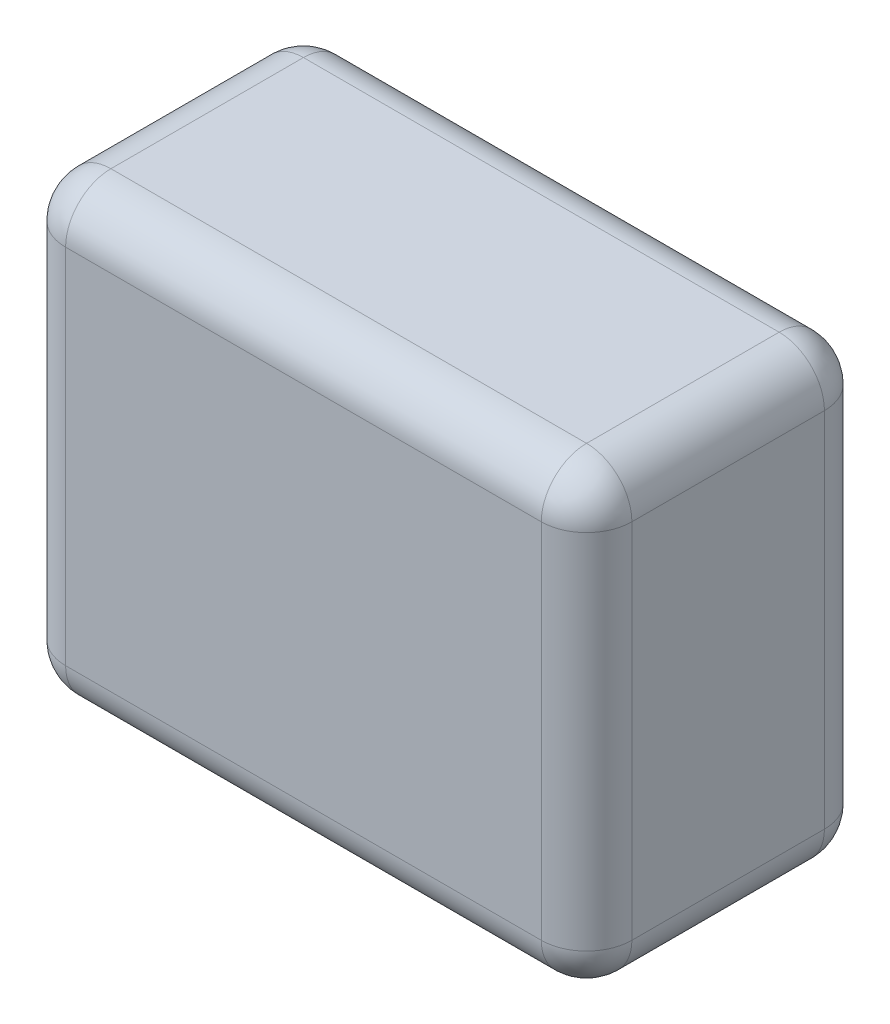
ISO-10303-21;
HEADER;
FILE_DESCRIPTION(('STEP AP214'),'2;1');
FILE_NAME('part.step','',(''),(''),'','','');
FILE_SCHEMA(('AUTOMOTIVE_DESIGN { 1 0 10303 214 1 1 1 1 }'));
ENDSEC;
DATA;
#1=APPLICATION_CONTEXT('core data for automotive mechanical design processes');
#2=APPLICATION_PROTOCOL_DEFINITION('international standard','automotive_design',2000,#1);
#3=PRODUCT_CONTEXT('',#1,'mechanical');
#4=PRODUCT('Part','Part','',(#3));
#5=PRODUCT_RELATED_PRODUCT_CATEGORY('part','',(#4));
#6=PRODUCT_DEFINITION_FORMATION('','',#4);
#7=PRODUCT_DEFINITION_CONTEXT('part definition',#1,'design');
#8=PRODUCT_DEFINITION('design','',#6,#7);
#9=PRODUCT_DEFINITION_SHAPE('','',#8);
#10=(LENGTH_UNIT() NAMED_UNIT(*) SI_UNIT(.MILLI.,.METRE.));
#11=(NAMED_UNIT(*) PLANE_ANGLE_UNIT() SI_UNIT($,.RADIAN.));
#12=(NAMED_UNIT(*) SI_UNIT($,.STERADIAN.) SOLID_ANGLE_UNIT());
#13=UNCERTAINTY_MEASURE_WITH_UNIT(LENGTH_MEASURE(1.E-05),#10,'distance_accuracy_value','');
#14=(GEOMETRIC_REPRESENTATION_CONTEXT(3) GLOBAL_UNCERTAINTY_ASSIGNED_CONTEXT((#13)) GLOBAL_UNIT_ASSIGNED_CONTEXT((#10,
#11,#12)) REPRESENTATION_CONTEXT('',''));
#15=CARTESIAN_POINT('',(0.,0.,0.));
#16=DIRECTION('',(0.,0.,1.));
#17=DIRECTION('',(1.,0.,0.));
#18=AXIS2_PLACEMENT_3D('',#15,#16,#17);
#19=CARTESIAN_POINT('',(25.,20.,25.));
#20=DIRECTION('',(-1.,0.,0.));
#21=DIRECTION('',(0.,-1.,0.));
#22=AXIS2_PLACEMENT_3D('',#19,#20,#21);
#23=PLANE('',#22);
#24=DIRECTION('',(0.,1.,0.));
#25=VECTOR('',#24,1.);
#26=CARTESIAN_POINT('',(25.,-20.,21.));
#27=LINE('',#26,#25);
#28=CARTESIAN_POINT('',(25.,16.,21.));
#29=VERTEX_POINT('',#28);
#30=CARTESIAN_POINT('',(25.,-16.,21.));
#31=VERTEX_POINT('',#30);
#32=EDGE_CURVE('E155',#29,#31,#27,.F.);
#33=ORIENTED_EDGE('',*,*,#32,.T.);
#34=DIRECTION('',(0.,0.,-1.));
#35=VECTOR('',#34,1.);
#36=CARTESIAN_POINT('',(25.,-16.,25.));
#37=LINE('',#36,#35);
#38=CARTESIAN_POINT('',(25.,-16.,4.));
#39=VERTEX_POINT('',#38);
#40=EDGE_CURVE('E158',#31,#39,#37,.T.);
#41=ORIENTED_EDGE('',*,*,#40,.T.);
#42=DIRECTION('',(0.,1.,0.));
#43=VECTOR('',#42,1.);
#44=CARTESIAN_POINT('',(25.,20.,4.));
#45=LINE('',#44,#43);
#46=CARTESIAN_POINT('',(25.,16.,4.));
#47=VERTEX_POINT('',#46);
#48=EDGE_CURVE('E131',#39,#47,#45,.T.);
#49=ORIENTED_EDGE('',*,*,#48,.T.);
#50=DIRECTION('',(0.,0.,-1.));
#51=VECTOR('',#50,1.);
#52=CARTESIAN_POINT('',(25.,16.,25.));
#53=LINE('',#52,#51);
#54=EDGE_CURVE('E149',#47,#29,#53,.F.);
#55=ORIENTED_EDGE('',*,*,#54,.T.);
#56=EDGE_LOOP('',(#33,#41,#49,#55));
#57=FACE_BOUND('',#56,.T.);
#58=ADVANCED_FACE('F37',(#57),#23,.F.);
#59=CARTESIAN_POINT('',(-25.,20.,25.));
#60=DIRECTION('',(0.,-1.,0.));
#61=DIRECTION('',(0.,0.,-1.));
#62=AXIS2_PLACEMENT_3D('',#59,#60,#61);
#63=PLANE('',#62);
#64=DIRECTION('',(0.,0.,-1.));
#65=VECTOR('',#64,1.);
#66=CARTESIAN_POINT('',(21.,20.,25.));
#67=LINE('',#66,#65);
#68=CARTESIAN_POINT('',(21.,20.,21.));
#69=VERTEX_POINT('',#68);
#70=CARTESIAN_POINT('',(21.,20.,4.));
#71=VERTEX_POINT('',#70);
#72=EDGE_CURVE('E173',#69,#71,#67,.T.);
#73=ORIENTED_EDGE('',*,*,#72,.T.);
#74=DIRECTION('',(-1.,0.,0.));
#75=VECTOR('',#74,1.);
#76=CARTESIAN_POINT('',(-25.,20.,4.));
#77=LINE('',#76,#75);
#78=CARTESIAN_POINT('',(-21.,20.,4.));
#79=VERTEX_POINT('',#78);
#80=EDGE_CURVE('E177',#71,#79,#77,.T.);
#81=ORIENTED_EDGE('',*,*,#80,.T.);
#82=DIRECTION('',(0.,0.,-1.));
#83=VECTOR('',#82,1.);
#84=CARTESIAN_POINT('',(-21.,20.,25.));
#85=LINE('',#84,#83);
#86=CARTESIAN_POINT('',(-21.,20.,21.));
#87=VERTEX_POINT('',#86);
#88=EDGE_CURVE('E175',#79,#87,#85,.F.);
#89=ORIENTED_EDGE('',*,*,#88,.T.);
#90=DIRECTION('',(-1.,0.,0.));
#91=VECTOR('',#90,1.);
#92=CARTESIAN_POINT('',(25.,20.,21.));
#93=LINE('',#92,#91);
#94=EDGE_CURVE('E171',#87,#69,#93,.F.);
#95=ORIENTED_EDGE('',*,*,#94,.T.);
#96=EDGE_LOOP('',(#73,#81,#89,#95));
#97=FACE_BOUND('',#96,.T.);
#98=ADVANCED_FACE('F326',(#97),#63,.F.);
#99=CARTESIAN_POINT('',(-25.,20.,25.));
#100=DIRECTION('',(1.,0.,0.));
#101=DIRECTION('',(0.,1.,0.));
#102=AXIS2_PLACEMENT_3D('',#99,#100,#101);
#103=PLANE('',#102);
#104=DIRECTION('',(0.,-1.,0.));
#105=VECTOR('',#104,1.);
#106=CARTESIAN_POINT('',(-25.,20.,4.));
#107=LINE('',#106,#105);
#108=CARTESIAN_POINT('',(-25.,16.,4.));
#109=VERTEX_POINT('',#108);
#110=CARTESIAN_POINT('',(-25.,-16.,4.));
#111=VERTEX_POINT('',#110);
#112=EDGE_CURVE('E184',#109,#111,#107,.T.);
#113=ORIENTED_EDGE('',*,*,#112,.T.);
#114=DIRECTION('',(0.,0.,-1.));
#115=VECTOR('',#114,1.);
#116=CARTESIAN_POINT('',(-25.,-16.,25.));
#117=LINE('',#116,#115);
#118=CARTESIAN_POINT('',(-25.,-16.,21.));
#119=VERTEX_POINT('',#118);
#120=EDGE_CURVE('E187',#111,#119,#117,.F.);
#121=ORIENTED_EDGE('',*,*,#120,.T.);
#122=DIRECTION('',(0.,-1.,0.));
#123=VECTOR('',#122,1.);
#124=CARTESIAN_POINT('',(-25.,20.,21.));
#125=LINE('',#124,#123);
#126=CARTESIAN_POINT('',(-25.,16.,21.));
#127=VERTEX_POINT('',#126);
#128=EDGE_CURVE('E182',#119,#127,#125,.F.);
#129=ORIENTED_EDGE('',*,*,#128,.T.);
#130=DIRECTION('',(0.,0.,-1.));
#131=VECTOR('',#130,1.);
#132=CARTESIAN_POINT('',(-25.,16.,25.));
#133=LINE('',#132,#131);
#134=EDGE_CURVE('E180',#127,#109,#133,.T.);
#135=ORIENTED_EDGE('',*,*,#134,.T.);
#136=EDGE_LOOP('',(#113,#121,#129,#135));
#137=FACE_BOUND('',#136,.T.);
#138=ADVANCED_FACE('F297',(#137),#103,.F.);
#139=CARTESIAN_POINT('',(-25.,-20.,25.));
#140=DIRECTION('',(0.,1.,0.));
#141=DIRECTION('',(0.,0.,1.));
#142=AXIS2_PLACEMENT_3D('',#139,#140,#141);
#143=PLANE('',#142);
#144=DIRECTION('',(1.,0.,0.));
#145=VECTOR('',#144,1.);
#146=CARTESIAN_POINT('',(-25.,-20.,4.));
#147=LINE('',#146,#145);
#148=CARTESIAN_POINT('',(-21.,-20.,4.));
#149=VERTEX_POINT('',#148);
#150=CARTESIAN_POINT('',(21.,-20.,4.));
#151=VERTEX_POINT('',#150);
#152=EDGE_CURVE('E193',#149,#151,#147,.T.);
#153=ORIENTED_EDGE('',*,*,#152,.T.);
#154=DIRECTION('',(0.,0.,-1.));
#155=VECTOR('',#154,1.);
#156=CARTESIAN_POINT('',(21.,-20.,25.));
#157=LINE('',#156,#155);
#158=CARTESIAN_POINT('',(21.,-20.,21.));
#159=VERTEX_POINT('',#158);
#160=EDGE_CURVE('E196',#151,#159,#157,.F.);
#161=ORIENTED_EDGE('',*,*,#160,.T.);
#162=DIRECTION('',(1.,0.,0.));
#163=VECTOR('',#162,1.);
#164=CARTESIAN_POINT('',(-25.,-20.,21.));
#165=LINE('',#164,#163);
#166=CARTESIAN_POINT('',(-21.,-20.,21.));
#167=VERTEX_POINT('',#166);
#168=EDGE_CURVE('E191',#159,#167,#165,.F.);
#169=ORIENTED_EDGE('',*,*,#168,.T.);
#170=DIRECTION('',(0.,0.,-1.));
#171=VECTOR('',#170,1.);
#172=CARTESIAN_POINT('',(-21.,-20.,25.));
#173=LINE('',#172,#171);
#174=EDGE_CURVE('E189',#167,#149,#173,.T.);
#175=ORIENTED_EDGE('',*,*,#174,.T.);
#176=EDGE_LOOP('',(#153,#161,#169,#175));
#177=FACE_BOUND('',#176,.T.);
#178=ADVANCED_FACE('F270',(#177),#143,.F.);
#179=CARTESIAN_POINT('',(0.,0.,25.));
#180=DIRECTION('',(0.,0.,1.));
#181=DIRECTION('',(1.,0.,0.));
#182=AXIS2_PLACEMENT_3D('',#179,#180,#181);
#183=PLANE('',#182);
#184=DIRECTION('',(0.,-1.,0.));
#185=VECTOR('',#184,1.);
#186=CARTESIAN_POINT('',(-21.,-20.,25.));
#187=LINE('',#186,#185);
#188=CARTESIAN_POINT('',(-21.,16.,25.));
#189=VERTEX_POINT('',#188);
#190=CARTESIAN_POINT('',(-21.,-16.,25.));
#191=VERTEX_POINT('',#190);
#192=EDGE_CURVE('E57',#189,#191,#187,.T.);
#193=ORIENTED_EDGE('',*,*,#192,.T.);
#194=DIRECTION('',(1.,0.,0.));
#195=VECTOR('',#194,1.);
#196=CARTESIAN_POINT('',(25.,-16.,25.));
#197=LINE('',#196,#195);
#198=CARTESIAN_POINT('',(21.,-16.,25.));
#199=VERTEX_POINT('',#198);
#200=EDGE_CURVE('E11',#191,#199,#197,.T.);
#201=ORIENTED_EDGE('',*,*,#200,.T.);
#202=DIRECTION('',(0.,1.,0.));
#203=VECTOR('',#202,1.);
#204=CARTESIAN_POINT('',(21.,20.,25.));
#205=LINE('',#204,#203);
#206=CARTESIAN_POINT('',(21.,16.,25.));
#207=VERTEX_POINT('',#206);
#208=EDGE_CURVE('E46',#199,#207,#205,.T.);
#209=ORIENTED_EDGE('',*,*,#208,.T.);
#210=DIRECTION('',(-1.,0.,0.));
#211=VECTOR('',#210,1.);
#212=CARTESIAN_POINT('',(-25.,16.,25.));
#213=LINE('',#212,#211);
#214=EDGE_CURVE('E198',#207,#189,#213,.T.);
#215=ORIENTED_EDGE('',*,*,#214,.T.);
#216=EDGE_LOOP('',(#193,#201,#209,#215));
#217=FACE_BOUND('',#216,.T.);
#218=ADVANCED_FACE('F285',(#217),#183,.T.);
#219=CARTESIAN_POINT('',(0.,0.,0.));
#220=DIRECTION('',(0.,0.,1.));
#221=DIRECTION('',(1.,0.,0.));
#222=AXIS2_PLACEMENT_3D('',#219,#220,#221);
#223=PLANE('',#222);
#224=DIRECTION('',(-1.,0.,0.));
#225=VECTOR('',#224,1.);
#226=CARTESIAN_POINT('',(0.,16.,0.));
#227=LINE('',#226,#225);
#228=CARTESIAN_POINT('',(-21.,16.,0.));
#229=VERTEX_POINT('',#228);
#230=CARTESIAN_POINT('',(21.,16.,0.));
#231=VERTEX_POINT('',#230);
#232=EDGE_CURVE('E168',#229,#231,#227,.F.);
#233=ORIENTED_EDGE('',*,*,#232,.T.);
#234=DIRECTION('',(0.,1.,0.));
#235=VECTOR('',#234,1.);
#236=CARTESIAN_POINT('',(21.,0.,0.));
#237=LINE('',#236,#235);
#238=CARTESIAN_POINT('',(21.,-16.,0.));
#239=VERTEX_POINT('',#238);
#240=EDGE_CURVE('E133',#231,#239,#237,.F.);
#241=ORIENTED_EDGE('',*,*,#240,.T.);
#242=DIRECTION('',(1.,0.,0.));
#243=VECTOR('',#242,1.);
#244=CARTESIAN_POINT('',(0.,-16.,0.));
#245=LINE('',#244,#243);
#246=CARTESIAN_POINT('',(-21.,-16.,0.));
#247=VERTEX_POINT('',#246);
#248=EDGE_CURVE('E161',#239,#247,#245,.F.);
#249=ORIENTED_EDGE('',*,*,#248,.T.);
#250=DIRECTION('',(0.,-1.,0.));
#251=VECTOR('',#250,1.);
#252=CARTESIAN_POINT('',(-21.,0.,0.));
#253=LINE('',#252,#251);
#254=EDGE_CURVE('E166',#247,#229,#253,.F.);
#255=ORIENTED_EDGE('',*,*,#254,.T.);
#256=EDGE_LOOP('',(#233,#241,#249,#255));
#257=FACE_BOUND('',#256,.T.);
#258=ADVANCED_FACE('F503',(#257),#223,.F.);
#259=CARTESIAN_POINT('',(-21.,0.,21.));
#260=DIRECTION('',(0.,1.,0.));
#261=DIRECTION('',(-1.,0.,0.));
#262=AXIS2_PLACEMENT_3D('',#259,#260,#261);
#263=CYLINDRICAL_SURFACE('',#262,4.);
#264=CARTESIAN_POINT('',(-21.,-16.,21.));
#265=DIRECTION('',(0.,-1.,0.));
#266=DIRECTION('',(0.,0.,-1.));
#267=AXIS2_PLACEMENT_3D('',#264,#265,#266);
#268=CIRCLE('',#267,4.);
#269=EDGE_CURVE('E41',#191,#119,#268,.T.);
#270=ORIENTED_EDGE('',*,*,#269,.F.);
#271=ORIENTED_EDGE('',*,*,#192,.F.);
#272=CARTESIAN_POINT('',(-21.,16.,21.));
#273=DIRECTION('',(0.,1.,0.));
#274=DIRECTION('',(0.,0.,1.));
#275=AXIS2_PLACEMENT_3D('',#272,#273,#274);
#276=CIRCLE('',#275,4.);
#277=EDGE_CURVE('E250',#127,#189,#276,.T.);
#278=ORIENTED_EDGE('',*,*,#277,.F.);
#279=ORIENTED_EDGE('',*,*,#128,.F.);
#280=EDGE_LOOP('',(#270,#271,#278,#279));
#281=FACE_BOUND('',#280,.T.);
#282=ADVANCED_FACE('F39',(#281),#263,.T.);
#283=CARTESIAN_POINT('',(-21.,-16.,21.));
#284=DIRECTION('',(-1.,0.,0.));
#285=DIRECTION('',(0.,0.,1.));
#286=AXIS2_PLACEMENT_3D('',#283,#284,#285);
#287=SPHERICAL_SURFACE('',#286,4.);
#288=CARTESIAN_POINT('',(-21.,-16.,21.));
#289=DIRECTION('',(-1.,0.,0.));
#290=DIRECTION('',(0.,0.,1.));
#291=AXIS2_PLACEMENT_3D('',#288,#289,#290);
#292=CIRCLE('',#291,4.);
#293=EDGE_CURVE('E245',#191,#167,#292,.F.);
#294=ORIENTED_EDGE('',*,*,#293,.F.);
#295=ORIENTED_EDGE('',*,*,#269,.T.);
#296=CARTESIAN_POINT('',(-21.,-16.,21.));
#297=DIRECTION('',(0.,0.,1.));
#298=DIRECTION('',(1.,0.,0.));
#299=AXIS2_PLACEMENT_3D('',#296,#297,#298);
#300=CIRCLE('',#299,4.);
#301=EDGE_CURVE('E248',#167,#119,#300,.F.);
#302=ORIENTED_EDGE('',*,*,#301,.F.);
#303=EDGE_LOOP('',(#294,#295,#302));
#304=FACE_BOUND('',#303,.T.);
#305=ADVANCED_FACE('F260',(#304),#287,.T.);
#306=CARTESIAN_POINT('',(-21.,16.,21.));
#307=DIRECTION('',(0.,0.,1.));
#308=DIRECTION('',(1.,0.,0.));
#309=AXIS2_PLACEMENT_3D('',#306,#307,#308);
#310=SPHERICAL_SURFACE('',#309,4.);
#311=CARTESIAN_POINT('',(-21.,16.,21.));
#312=DIRECTION('',(0.,0.,1.));
#313=DIRECTION('',(1.,0.,0.));
#314=AXIS2_PLACEMENT_3D('',#311,#312,#313);
#315=CIRCLE('',#314,4.);
#316=EDGE_CURVE('E239',#127,#87,#315,.F.);
#317=ORIENTED_EDGE('',*,*,#316,.F.);
#318=ORIENTED_EDGE('',*,*,#277,.T.);
#319=CARTESIAN_POINT('',(-21.,16.,21.));
#320=DIRECTION('',(-1.,0.,0.));
#321=DIRECTION('',(0.,-1.,0.));
#322=AXIS2_PLACEMENT_3D('',#319,#320,#321);
#323=CIRCLE('',#322,4.);
#324=EDGE_CURVE('E242',#87,#189,#323,.F.);
#325=ORIENTED_EDGE('',*,*,#324,.F.);
#326=EDGE_LOOP('',(#317,#318,#325));
#327=FACE_BOUND('',#326,.T.);
#328=ADVANCED_FACE('F289',(#327),#310,.T.);
#329=CARTESIAN_POINT('',(-21.,-16.,25.));
#330=DIRECTION('',(0.,0.,-1.));
#331=DIRECTION('',(-1.,0.,0.));
#332=AXIS2_PLACEMENT_3D('',#329,#330,#331);
#333=CYLINDRICAL_SURFACE('',#332,4.);
#334=ORIENTED_EDGE('',*,*,#301,.T.);
#335=ORIENTED_EDGE('',*,*,#120,.F.);
#336=CARTESIAN_POINT('',(-21.,-16.,4.));
#337=DIRECTION('',(0.,0.,-1.));
#338=DIRECTION('',(-1.,0.,0.));
#339=AXIS2_PLACEMENT_3D('',#336,#337,#338);
#340=CIRCLE('',#339,4.);
#341=EDGE_CURVE('E234',#149,#111,#340,.T.);
#342=ORIENTED_EDGE('',*,*,#341,.F.);
#343=ORIENTED_EDGE('',*,*,#174,.F.);
#344=EDGE_LOOP('',(#334,#335,#342,#343));
#345=FACE_BOUND('',#344,.T.);
#346=ADVANCED_FACE('F266',(#345),#333,.T.);
#347=CARTESIAN_POINT('',(0.,-16.,21.));
#348=DIRECTION('',(-1.,0.,0.));
#349=DIRECTION('',(0.,0.,1.));
#350=AXIS2_PLACEMENT_3D('',#347,#348,#349);
#351=CYLINDRICAL_SURFACE('',#350,4.);
#352=ORIENTED_EDGE('',*,*,#293,.T.);
#353=ORIENTED_EDGE('',*,*,#168,.F.);
#354=CARTESIAN_POINT('',(21.,-16.,21.));
#355=DIRECTION('',(1.,0.,0.));
#356=DIRECTION('',(0.,0.,-1.));
#357=AXIS2_PLACEMENT_3D('',#354,#355,#356);
#358=CIRCLE('',#357,4.);
#359=EDGE_CURVE('E231',#199,#159,#358,.T.);
#360=ORIENTED_EDGE('',*,*,#359,.F.);
#361=ORIENTED_EDGE('',*,*,#200,.F.);
#362=EDGE_LOOP('',(#352,#353,#360,#361));
#363=FACE_BOUND('',#362,.T.);
#364=ADVANCED_FACE('F276',(#363),#351,.T.);
#365=CARTESIAN_POINT('',(21.,0.,21.));
#366=DIRECTION('',(0.,-1.,0.));
#367=DIRECTION('',(1.,0.,0.));
#368=AXIS2_PLACEMENT_3D('',#365,#366,#367);
#369=CYLINDRICAL_SURFACE('',#368,4.);
#370=CARTESIAN_POINT('',(21.,16.,21.));
#371=DIRECTION('',(0.,1.,0.));
#372=DIRECTION('',(0.,0.,1.));
#373=AXIS2_PLACEMENT_3D('',#370,#371,#372);
#374=CIRCLE('',#373,4.);
#375=EDGE_CURVE('E225',#207,#29,#374,.T.);
#376=ORIENTED_EDGE('',*,*,#375,.F.);
#377=ORIENTED_EDGE('',*,*,#208,.F.);
#378=CARTESIAN_POINT('',(21.,-16.,21.));
#379=DIRECTION('',(0.,-1.,0.));
#380=DIRECTION('',(0.,0.,-1.));
#381=AXIS2_PLACEMENT_3D('',#378,#379,#380);
#382=CIRCLE('',#381,4.);
#383=EDGE_CURVE('E228',#31,#199,#382,.T.);
#384=ORIENTED_EDGE('',*,*,#383,.F.);
#385=ORIENTED_EDGE('',*,*,#32,.F.);
#386=EDGE_LOOP('',(#376,#377,#384,#385));
#387=FACE_BOUND('',#386,.T.);
#388=ADVANCED_FACE('F283',(#387),#369,.T.);
#389=CARTESIAN_POINT('',(0.,16.,21.));
#390=DIRECTION('',(1.,0.,0.));
#391=DIRECTION('',(0.,0.,-1.));
#392=AXIS2_PLACEMENT_3D('',#389,#390,#391);
#393=CYLINDRICAL_SURFACE('',#392,4.);
#394=ORIENTED_EDGE('',*,*,#324,.T.);
#395=ORIENTED_EDGE('',*,*,#214,.F.);
#396=CARTESIAN_POINT('',(21.,16.,21.));
#397=DIRECTION('',(1.,0.,0.));
#398=DIRECTION('',(0.,0.,-1.));
#399=AXIS2_PLACEMENT_3D('',#396,#397,#398);
#400=CIRCLE('',#399,4.);
#401=EDGE_CURVE('E223',#69,#207,#400,.T.);
#402=ORIENTED_EDGE('',*,*,#401,.F.);
#403=ORIENTED_EDGE('',*,*,#94,.F.);
#404=EDGE_LOOP('',(#394,#395,#402,#403));
#405=FACE_BOUND('',#404,.T.);
#406=ADVANCED_FACE('F440',(#405),#393,.T.);
#407=CARTESIAN_POINT('',(-21.,16.,25.));
#408=DIRECTION('',(0.,0.,-1.));
#409=DIRECTION('',(-1.,0.,0.));
#410=AXIS2_PLACEMENT_3D('',#407,#408,#409);
#411=CYLINDRICAL_SURFACE('',#410,4.);
#412=ORIENTED_EDGE('',*,*,#316,.T.);
#413=ORIENTED_EDGE('',*,*,#88,.F.);
#414=CARTESIAN_POINT('',(-21.,16.,4.));
#415=DIRECTION('',(0.,0.,-1.));
#416=DIRECTION('',(-1.,0.,0.));
#417=AXIS2_PLACEMENT_3D('',#414,#415,#416);
#418=CIRCLE('',#417,4.);
#419=EDGE_CURVE('E220',#109,#79,#418,.T.);
#420=ORIENTED_EDGE('',*,*,#419,.F.);
#421=ORIENTED_EDGE('',*,*,#134,.F.);
#422=EDGE_LOOP('',(#412,#413,#420,#421));
#423=FACE_BOUND('',#422,.T.);
#424=ADVANCED_FACE('F294',(#423),#411,.T.);
#425=CARTESIAN_POINT('',(-21.,20.,4.));
#426=DIRECTION('',(0.,-1.,0.));
#427=DIRECTION('',(1.,0.,0.));
#428=AXIS2_PLACEMENT_3D('',#425,#426,#427);
#429=CYLINDRICAL_SURFACE('',#428,4.);
#430=CARTESIAN_POINT('',(-21.,-16.,4.));
#431=DIRECTION('',(0.,-1.,0.));
#432=DIRECTION('',(0.,0.,-1.));
#433=AXIS2_PLACEMENT_3D('',#430,#431,#432);
#434=CIRCLE('',#433,4.);
#435=EDGE_CURVE('E236',#111,#247,#434,.T.);
#436=ORIENTED_EDGE('',*,*,#435,.F.);
#437=ORIENTED_EDGE('',*,*,#112,.F.);
#438=CARTESIAN_POINT('',(-21.,16.,4.));
#439=DIRECTION('',(0.,1.,0.));
#440=DIRECTION('',(0.,0.,1.));
#441=AXIS2_PLACEMENT_3D('',#438,#439,#440);
#442=CIRCLE('',#441,4.);
#443=EDGE_CURVE('E217',#229,#109,#442,.T.);
#444=ORIENTED_EDGE('',*,*,#443,.F.);
#445=ORIENTED_EDGE('',*,*,#254,.F.);
#446=EDGE_LOOP('',(#436,#437,#444,#445));
#447=FACE_BOUND('',#446,.T.);
#448=ADVANCED_FACE('F301',(#447),#429,.T.);
#449=CARTESIAN_POINT('',(-21.,-16.,4.));
#450=DIRECTION('',(-1.,0.,0.));
#451=DIRECTION('',(0.,0.,1.));
#452=AXIS2_PLACEMENT_3D('',#449,#450,#451);
#453=SPHERICAL_SURFACE('',#452,4.);
#454=ORIENTED_EDGE('',*,*,#341,.T.);
#455=ORIENTED_EDGE('',*,*,#435,.T.);
#456=CARTESIAN_POINT('',(-21.,-16.,4.));
#457=DIRECTION('',(-1.,0.,0.));
#458=DIRECTION('',(0.,0.,1.));
#459=AXIS2_PLACEMENT_3D('',#456,#457,#458);
#460=CIRCLE('',#459,4.);
#461=EDGE_CURVE('E214',#149,#247,#460,.F.);
#462=ORIENTED_EDGE('',*,*,#461,.F.);
#463=EDGE_LOOP('',(#454,#455,#462));
#464=FACE_BOUND('',#463,.T.);
#465=ADVANCED_FACE('F305',(#464),#453,.T.);
#466=CARTESIAN_POINT('',(21.,-16.,21.));
#467=DIRECTION('',(0.,0.,1.));
#468=DIRECTION('',(1.,0.,0.));
#469=AXIS2_PLACEMENT_3D('',#466,#467,#468);
#470=SPHERICAL_SURFACE('',#469,4.);
#471=ORIENTED_EDGE('',*,*,#383,.T.);
#472=ORIENTED_EDGE('',*,*,#359,.T.);
#473=CARTESIAN_POINT('',(21.,-16.,21.));
#474=DIRECTION('',(0.,0.,1.));
#475=DIRECTION('',(1.,0.,0.));
#476=AXIS2_PLACEMENT_3D('',#473,#474,#475);
#477=CIRCLE('',#476,4.);
#478=EDGE_CURVE('E211',#31,#159,#477,.F.);
#479=ORIENTED_EDGE('',*,*,#478,.F.);
#480=EDGE_LOOP('',(#471,#472,#479));
#481=FACE_BOUND('',#480,.T.);
#482=ADVANCED_FACE('F280',(#481),#470,.T.);
#483=CARTESIAN_POINT('',(21.,16.,21.));
#484=DIRECTION('',(0.,0.,1.));
#485=DIRECTION('',(1.,0.,0.));
#486=AXIS2_PLACEMENT_3D('',#483,#484,#485);
#487=SPHERICAL_SURFACE('',#486,4.);
#488=ORIENTED_EDGE('',*,*,#401,.T.);
#489=ORIENTED_EDGE('',*,*,#375,.T.);
#490=CARTESIAN_POINT('',(21.,16.,21.));
#491=DIRECTION('',(0.,0.,1.));
#492=DIRECTION('',(1.,0.,0.));
#493=AXIS2_PLACEMENT_3D('',#490,#491,#492);
#494=CIRCLE('',#493,4.);
#495=EDGE_CURVE('E152',#69,#29,#494,.F.);
#496=ORIENTED_EDGE('',*,*,#495,.F.);
#497=EDGE_LOOP('',(#488,#489,#496));
#498=FACE_BOUND('',#497,.T.);
#499=ADVANCED_FACE('F392',(#498),#487,.T.);
#500=CARTESIAN_POINT('',(-21.,16.,4.));
#501=DIRECTION('',(-1.,0.,0.));
#502=DIRECTION('',(0.,0.,1.));
#503=AXIS2_PLACEMENT_3D('',#500,#501,#502);
#504=SPHERICAL_SURFACE('',#503,4.);
#505=ORIENTED_EDGE('',*,*,#443,.T.);
#506=ORIENTED_EDGE('',*,*,#419,.T.);
#507=CARTESIAN_POINT('',(-21.,16.,4.));
#508=DIRECTION('',(-1.,0.,0.));
#509=DIRECTION('',(0.,0.,1.));
#510=AXIS2_PLACEMENT_3D('',#507,#508,#509);
#511=CIRCLE('',#510,4.);
#512=EDGE_CURVE('E208',#229,#79,#511,.F.);
#513=ORIENTED_EDGE('',*,*,#512,.F.);
#514=EDGE_LOOP('',(#505,#506,#513));
#515=FACE_BOUND('',#514,.T.);
#516=ADVANCED_FACE('F382',(#515),#504,.T.);
#517=CARTESIAN_POINT('',(-25.,-16.,4.));
#518=DIRECTION('',(1.,0.,0.));
#519=DIRECTION('',(0.,0.,-1.));
#520=AXIS2_PLACEMENT_3D('',#517,#518,#519);
#521=CYLINDRICAL_SURFACE('',#520,4.);
#522=ORIENTED_EDGE('',*,*,#461,.T.);
#523=ORIENTED_EDGE('',*,*,#248,.F.);
#524=CARTESIAN_POINT('',(21.,-16.,4.));
#525=DIRECTION('',(1.,0.,0.));
#526=DIRECTION('',(0.,0.,-1.));
#527=AXIS2_PLACEMENT_3D('',#524,#525,#526);
#528=CIRCLE('',#527,4.);
#529=EDGE_CURVE('E205',#151,#239,#528,.T.);
#530=ORIENTED_EDGE('',*,*,#529,.F.);
#531=ORIENTED_EDGE('',*,*,#152,.F.);
#532=EDGE_LOOP('',(#522,#523,#530,#531));
#533=FACE_BOUND('',#532,.T.);
#534=ADVANCED_FACE('F308',(#533),#521,.T.);
#535=CARTESIAN_POINT('',(21.,-16.,25.));
#536=DIRECTION('',(0.,0.,-1.));
#537=DIRECTION('',(-1.,0.,0.));
#538=AXIS2_PLACEMENT_3D('',#535,#536,#537);
#539=CYLINDRICAL_SURFACE('',#538,4.);
#540=ORIENTED_EDGE('',*,*,#478,.T.);
#541=ORIENTED_EDGE('',*,*,#160,.F.);
#542=CARTESIAN_POINT('',(21.,-16.,4.));
#543=DIRECTION('',(0.,0.,-1.));
#544=DIRECTION('',(-1.,0.,0.));
#545=AXIS2_PLACEMENT_3D('',#542,#543,#544);
#546=CIRCLE('',#545,4.);
#547=EDGE_CURVE('E146',#39,#151,#546,.T.);
#548=ORIENTED_EDGE('',*,*,#547,.F.);
#549=ORIENTED_EDGE('',*,*,#40,.F.);
#550=EDGE_LOOP('',(#540,#541,#548,#549));
#551=FACE_BOUND('',#550,.T.);
#552=ADVANCED_FACE('F313',(#551),#539,.T.);
#553=CARTESIAN_POINT('',(21.,16.,25.));
#554=DIRECTION('',(0.,0.,-1.));
#555=DIRECTION('',(-1.,0.,0.));
#556=AXIS2_PLACEMENT_3D('',#553,#554,#555);
#557=CYLINDRICAL_SURFACE('',#556,4.);
#558=ORIENTED_EDGE('',*,*,#495,.T.);
#559=ORIENTED_EDGE('',*,*,#54,.F.);
#560=CARTESIAN_POINT('',(21.,16.,4.));
#561=DIRECTION('',(0.,0.,-1.));
#562=DIRECTION('',(-1.,0.,0.));
#563=AXIS2_PLACEMENT_3D('',#560,#561,#562);
#564=CIRCLE('',#563,4.);
#565=EDGE_CURVE('E139',#71,#47,#564,.T.);
#566=ORIENTED_EDGE('',*,*,#565,.F.);
#567=ORIENTED_EDGE('',*,*,#72,.F.);
#568=EDGE_LOOP('',(#558,#559,#566,#567));
#569=FACE_BOUND('',#568,.T.);
#570=ADVANCED_FACE('F150',(#569),#557,.T.);
#571=CARTESIAN_POINT('',(-25.,16.,4.));
#572=DIRECTION('',(-1.,0.,0.));
#573=DIRECTION('',(0.,0.,1.));
#574=AXIS2_PLACEMENT_3D('',#571,#572,#573);
#575=CYLINDRICAL_SURFACE('',#574,4.);
#576=ORIENTED_EDGE('',*,*,#512,.T.);
#577=ORIENTED_EDGE('',*,*,#80,.F.);
#578=CARTESIAN_POINT('',(21.,16.,4.));
#579=DIRECTION('',(1.,0.,0.));
#580=DIRECTION('',(0.,1.,0.));
#581=AXIS2_PLACEMENT_3D('',#578,#579,#580);
#582=CIRCLE('',#581,4.);
#583=EDGE_CURVE('E143',#231,#71,#582,.T.);
#584=ORIENTED_EDGE('',*,*,#583,.F.);
#585=ORIENTED_EDGE('',*,*,#232,.F.);
#586=EDGE_LOOP('',(#576,#577,#584,#585));
#587=FACE_BOUND('',#586,.T.);
#588=ADVANCED_FACE('F316',(#587),#575,.T.);
#589=CARTESIAN_POINT('',(21.,-16.,4.));
#590=DIRECTION('',(0.,-1.,0.));
#591=DIRECTION('',(0.,0.,-1.));
#592=AXIS2_PLACEMENT_3D('',#589,#590,#591);
#593=SPHERICAL_SURFACE('',#592,4.);
#594=ORIENTED_EDGE('',*,*,#547,.T.);
#595=ORIENTED_EDGE('',*,*,#529,.T.);
#596=CARTESIAN_POINT('',(21.,-16.,4.));
#597=DIRECTION('',(0.,-1.,0.));
#598=DIRECTION('',(1.,0.,0.));
#599=AXIS2_PLACEMENT_3D('',#596,#597,#598);
#600=CIRCLE('',#599,4.);
#601=EDGE_CURVE('E136',#39,#239,#600,.F.);
#602=ORIENTED_EDGE('',*,*,#601,.F.);
#603=EDGE_LOOP('',(#594,#595,#602));
#604=FACE_BOUND('',#603,.T.);
#605=ADVANCED_FACE('F314',(#604),#593,.T.);
#606=CARTESIAN_POINT('',(21.,16.,4.));
#607=DIRECTION('',(0.,1.,0.));
#608=DIRECTION('',(-1.,0.,0.));
#609=AXIS2_PLACEMENT_3D('',#606,#607,#608);
#610=SPHERICAL_SURFACE('',#609,4.);
#611=ORIENTED_EDGE('',*,*,#583,.T.);
#612=ORIENTED_EDGE('',*,*,#565,.T.);
#613=CARTESIAN_POINT('',(21.,16.,4.));
#614=DIRECTION('',(0.,1.,0.));
#615=DIRECTION('',(0.,0.,1.));
#616=AXIS2_PLACEMENT_3D('',#613,#614,#615);
#617=CIRCLE('',#616,4.);
#618=EDGE_CURVE('E127',#231,#47,#617,.F.);
#619=ORIENTED_EDGE('',*,*,#618,.F.);
#620=EDGE_LOOP('',(#611,#612,#619));
#621=FACE_BOUND('',#620,.T.);
#622=ADVANCED_FACE('F141',(#621),#610,.T.);
#623=CARTESIAN_POINT('',(21.,20.,4.));
#624=DIRECTION('',(0.,1.,0.));
#625=DIRECTION('',(-1.,0.,0.));
#626=AXIS2_PLACEMENT_3D('',#623,#624,#625);
#627=CYLINDRICAL_SURFACE('',#626,4.);
#628=ORIENTED_EDGE('',*,*,#601,.T.);
#629=ORIENTED_EDGE('',*,*,#240,.F.);
#630=ORIENTED_EDGE('',*,*,#618,.T.);
#631=ORIENTED_EDGE('',*,*,#48,.F.);
#632=EDGE_LOOP('',(#628,#629,#630,#631));
#633=FACE_BOUND('',#632,.T.);
#634=ADVANCED_FACE('F129',(#633),#627,.T.);
#635=CLOSED_SHELL('',(#58,#98,#138,#178,#218,#258,#282,#305,#328,#346,#364,#388,#406,#424,#448,
#465,#482,#499,#516,#534,#552,#570,#588,#605,#622,#634));
#636=MANIFOLD_SOLID_BREP('B2',#635);
#637=ADVANCED_BREP_SHAPE_REPRESENTATION('',(#18,#636),#14);
#638=SHAPE_DEFINITION_REPRESENTATION(#9,#637);
ENDSEC;
END-ISO-10303-21;
